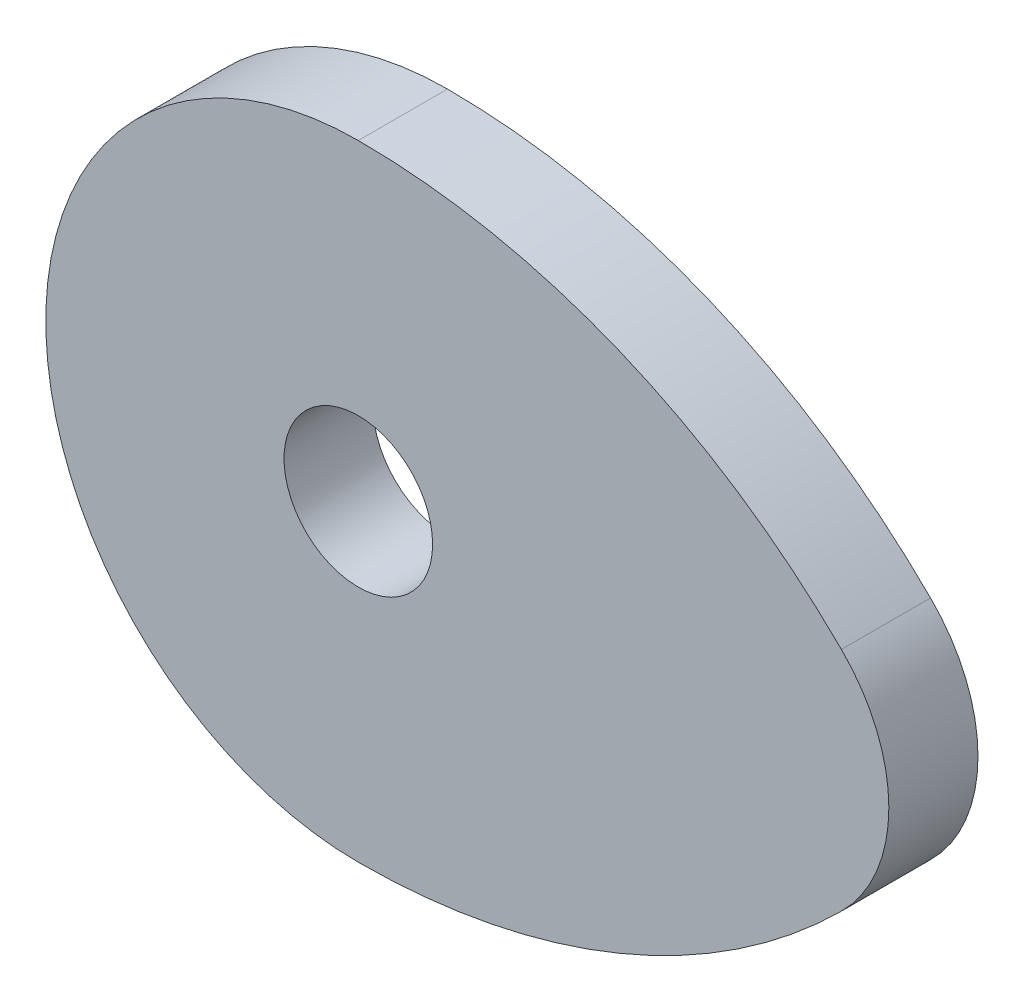
ISO-10303-21;
HEADER;
FILE_DESCRIPTION(('STEP AP214'),'2;1');
FILE_NAME('part.step','',(''),(''),'','','');
FILE_SCHEMA(('AUTOMOTIVE_DESIGN { 1 0 10303 214 1 1 1 1 }'));
ENDSEC;
DATA;
#1=APPLICATION_CONTEXT('core data for automotive mechanical design processes');
#2=APPLICATION_PROTOCOL_DEFINITION('international standard','automotive_design',2000,#1);
#3=PRODUCT_CONTEXT('',#1,'mechanical');
#4=PRODUCT('Part','Part','',(#3));
#5=PRODUCT_RELATED_PRODUCT_CATEGORY('part','',(#4));
#6=PRODUCT_DEFINITION_FORMATION('','',#4);
#7=PRODUCT_DEFINITION_CONTEXT('part definition',#1,'design');
#8=PRODUCT_DEFINITION('design','',#6,#7);
#9=PRODUCT_DEFINITION_SHAPE('','',#8);
#10=(LENGTH_UNIT() NAMED_UNIT(*) SI_UNIT(.MILLI.,.METRE.));
#11=(NAMED_UNIT(*) PLANE_ANGLE_UNIT() SI_UNIT($,.RADIAN.));
#12=(NAMED_UNIT(*) SI_UNIT($,.STERADIAN.) SOLID_ANGLE_UNIT());
#13=UNCERTAINTY_MEASURE_WITH_UNIT(LENGTH_MEASURE(1.E-05),#10,'distance_accuracy_value','');
#14=(GEOMETRIC_REPRESENTATION_CONTEXT(3) GLOBAL_UNCERTAINTY_ASSIGNED_CONTEXT((#13)) GLOBAL_UNIT_ASSIGNED_CONTEXT((#10,
#11,#12)) REPRESENTATION_CONTEXT('',''));
#15=CARTESIAN_POINT('',(0.,0.,0.));
#16=DIRECTION('',(0.,0.,1.));
#17=DIRECTION('',(1.,0.,0.));
#18=AXIS2_PLACEMENT_3D('',#15,#16,#17);
#19=CARTESIAN_POINT('',(12.5,-12.5467980655753,6.));
#20=DIRECTION('',(0.,0.,-1.));
#21=DIRECTION('',(-1.,0.,0.));
#22=AXIS2_PLACEMENT_3D('',#19,#20,#21);
#23=PLANE('',#22);
#24=CARTESIAN_POINT('',(0.,-25.0935961311506,6.));
#25=DIRECTION('',(0.,0.,-1.));
#26=DIRECTION('',(-1.,0.,0.));
#27=AXIS2_PLACEMENT_3D('',#24,#25,#26);
#28=CIRCLE('',#27,46.1281776350312);
#29=CARTESIAN_POINT('',(0.,21.0345815038806,6.));
#30=VERTEX_POINT('',#29);
#31=CARTESIAN_POINT('',(32.5134520010286,7.62771513392252,6.));
#32=VERTEX_POINT('',#31);
#33=EDGE_CURVE('E112',#30,#32,#28,.T.);
#34=ORIENTED_EDGE('',*,*,#33,.F.);
#35=CARTESIAN_POINT('',(0.,0.,6.));
#36=DIRECTION('',(0.,0.,1.));
#37=DIRECTION('',(1.,0.,0.));
#38=AXIS2_PLACEMENT_3D('',#35,#36,#37);
#39=CIRCLE('',#38,21.0345815038806);
#40=CARTESIAN_POINT('',(0.,-21.0345815038806,6.));
#41=VERTEX_POINT('',#40);
#42=EDGE_CURVE('E100',#30,#41,#39,.T.);
#43=ORIENTED_EDGE('',*,*,#42,.T.);
#44=CARTESIAN_POINT('',(0.,25.0935961311506,6.));
#45=DIRECTION('',(0.,0.,1.));
#46=DIRECTION('',(1.,0.,0.));
#47=AXIS2_PLACEMENT_3D('',#44,#45,#46);
#48=CIRCLE('',#47,46.1281776350312);
#49=CARTESIAN_POINT('',(32.5134520010286,-7.62771513392253,6.));
#50=VERTEX_POINT('',#49);
#51=EDGE_CURVE('E97',#41,#50,#48,.T.);
#52=ORIENTED_EDGE('',*,*,#51,.T.);
#53=CARTESIAN_POINT('',(25.,0.,6.));
#54=DIRECTION('',(0.,0.,1.));
#55=DIRECTION('',(1.,0.,0.));
#56=AXIS2_PLACEMENT_3D('',#53,#54,#55);
#57=CIRCLE('',#56,10.706726817101);
#58=EDGE_CURVE('E94',#50,#32,#57,.T.);
#59=ORIENTED_EDGE('',*,*,#58,.T.);
#60=EDGE_LOOP('',(#34,#43,#52,#59));
#61=FACE_BOUND('',#60,.T.);
#62=CARTESIAN_POINT('',(0.,0.,6.));
#63=DIRECTION('',(0.,0.,1.));
#64=DIRECTION('',(1.,0.,0.));
#65=AXIS2_PLACEMENT_3D('',#62,#63,#64);
#66=CIRCLE('',#65,5.);
#67=CARTESIAN_POINT('',(5.,0.,6.));
#68=VERTEX_POINT('',#67);
#69=EDGE_CURVE('E122',#68,#68,#66,.T.);
#70=ORIENTED_EDGE('',*,*,#69,.F.);
#71=EDGE_LOOP('',(#70));
#72=FACE_BOUND('',#71,.T.);
#73=ADVANCED_FACE('F51',(#61,#72),#23,.F.);
#74=CARTESIAN_POINT('',(12.5,-12.5467980655753,0.));
#75=DIRECTION('',(0.,0.,-1.));
#76=DIRECTION('',(-1.,0.,0.));
#77=AXIS2_PLACEMENT_3D('',#74,#75,#76);
#78=PLANE('',#77);
#79=CARTESIAN_POINT('',(0.,-25.0935961311506,0.));
#80=DIRECTION('',(0.,0.,-1.));
#81=DIRECTION('',(-1.,0.,0.));
#82=AXIS2_PLACEMENT_3D('',#79,#80,#81);
#83=CIRCLE('',#82,46.1281776350312);
#84=CARTESIAN_POINT('',(0.,21.0345815038806,0.));
#85=VERTEX_POINT('',#84);
#86=CARTESIAN_POINT('',(32.5134520010286,7.62771513392252,0.));
#87=VERTEX_POINT('',#86);
#88=EDGE_CURVE('E118',#85,#87,#83,.T.);
#89=ORIENTED_EDGE('',*,*,#88,.T.);
#90=CARTESIAN_POINT('',(25.,0.,0.));
#91=DIRECTION('',(0.,0.,1.));
#92=DIRECTION('',(1.,0.,0.));
#93=AXIS2_PLACEMENT_3D('',#90,#91,#92);
#94=CIRCLE('',#93,10.706726817101);
#95=CARTESIAN_POINT('',(32.5134520010286,-7.62771513392253,0.));
#96=VERTEX_POINT('',#95);
#97=EDGE_CURVE('E121',#96,#87,#94,.T.);
#98=ORIENTED_EDGE('',*,*,#97,.F.);
#99=CARTESIAN_POINT('',(0.,25.0935961311506,0.));
#100=DIRECTION('',(0.,0.,1.));
#101=DIRECTION('',(1.,0.,0.));
#102=AXIS2_PLACEMENT_3D('',#99,#100,#101);
#103=CIRCLE('',#102,46.1281776350312);
#104=CARTESIAN_POINT('',(0.,-21.0345815038806,0.));
#105=VERTEX_POINT('',#104);
#106=EDGE_CURVE('E107',#105,#96,#103,.T.);
#107=ORIENTED_EDGE('',*,*,#106,.F.);
#108=CARTESIAN_POINT('',(0.,0.,0.));
#109=DIRECTION('',(0.,0.,1.));
#110=DIRECTION('',(1.,0.,0.));
#111=AXIS2_PLACEMENT_3D('',#108,#109,#110);
#112=CIRCLE('',#111,21.0345815038806);
#113=EDGE_CURVE('E85',#85,#105,#112,.T.);
#114=ORIENTED_EDGE('',*,*,#113,.F.);
#115=EDGE_LOOP('',(#89,#98,#107,#114));
#116=FACE_BOUND('',#115,.T.);
#117=CARTESIAN_POINT('',(0.,0.,0.));
#118=DIRECTION('',(0.,0.,1.));
#119=DIRECTION('',(1.,0.,0.));
#120=AXIS2_PLACEMENT_3D('',#117,#118,#119);
#121=CIRCLE('',#120,5.);
#122=CARTESIAN_POINT('',(5.,0.,0.));
#123=VERTEX_POINT('',#122);
#124=EDGE_CURVE('E157',#123,#123,#121,.T.);
#125=ORIENTED_EDGE('',*,*,#124,.T.);
#126=EDGE_LOOP('',(#125));
#127=FACE_BOUND('',#126,.T.);
#128=ADVANCED_FACE('F127',(#116,#127),#78,.T.);
#129=CARTESIAN_POINT('',(0.,-25.0935961311506,6.));
#130=DIRECTION('',(0.,0.,-1.));
#131=DIRECTION('',(-1.,0.,0.));
#132=AXIS2_PLACEMENT_3D('',#129,#130,#131);
#133=CYLINDRICAL_SURFACE('',#132,46.1281776350312);
#134=ORIENTED_EDGE('',*,*,#88,.F.);
#135=DIRECTION('',(0.,0.,-1.));
#136=VECTOR('',#135,1.);
#137=CARTESIAN_POINT('',(0.,21.0345815038806,6.));
#138=LINE('',#137,#136);
#139=EDGE_CURVE('E12',#30,#85,#138,.T.);
#140=ORIENTED_EDGE('',*,*,#139,.F.);
#141=ORIENTED_EDGE('',*,*,#33,.T.);
#142=DIRECTION('',(0.,0.,-1.));
#143=VECTOR('',#142,1.);
#144=CARTESIAN_POINT('',(32.5134520010286,7.62771513392252,6.));
#145=LINE('',#144,#143);
#146=EDGE_CURVE('E55',#32,#87,#145,.T.);
#147=ORIENTED_EDGE('',*,*,#146,.T.);
#148=EDGE_LOOP('',(#134,#140,#141,#147));
#149=FACE_BOUND('',#148,.T.);
#150=ADVANCED_FACE('F53',(#149),#133,.T.);
#151=CARTESIAN_POINT('',(0.,0.,6.));
#152=DIRECTION('',(0.,0.,-1.));
#153=DIRECTION('',(-1.,0.,0.));
#154=AXIS2_PLACEMENT_3D('',#151,#152,#153);
#155=CYLINDRICAL_SURFACE('',#154,21.0345815038806);
#156=ORIENTED_EDGE('',*,*,#113,.T.);
#157=DIRECTION('',(0.,0.,-1.));
#158=VECTOR('',#157,1.);
#159=CARTESIAN_POINT('',(0.,-21.0345815038806,6.));
#160=LINE('',#159,#158);
#161=EDGE_CURVE('E61',#41,#105,#160,.T.);
#162=ORIENTED_EDGE('',*,*,#161,.F.);
#163=ORIENTED_EDGE('',*,*,#42,.F.);
#164=ORIENTED_EDGE('',*,*,#139,.T.);
#165=EDGE_LOOP('',(#156,#162,#163,#164));
#166=FACE_BOUND('',#165,.T.);
#167=ADVANCED_FACE('F130',(#166),#155,.T.);
#168=CARTESIAN_POINT('',(0.,25.0935961311506,6.));
#169=DIRECTION('',(0.,0.,-1.));
#170=DIRECTION('',(-1.,0.,0.));
#171=AXIS2_PLACEMENT_3D('',#168,#169,#170);
#172=CYLINDRICAL_SURFACE('',#171,46.1281776350312);
#173=ORIENTED_EDGE('',*,*,#106,.T.);
#174=DIRECTION('',(0.,0.,-1.));
#175=VECTOR('',#174,1.);
#176=CARTESIAN_POINT('',(32.5134520010286,-7.62771513392253,6.));
#177=LINE('',#176,#175);
#178=EDGE_CURVE('E104',#50,#96,#177,.T.);
#179=ORIENTED_EDGE('',*,*,#178,.F.);
#180=ORIENTED_EDGE('',*,*,#51,.F.);
#181=ORIENTED_EDGE('',*,*,#161,.T.);
#182=EDGE_LOOP('',(#173,#179,#180,#181));
#183=FACE_BOUND('',#182,.T.);
#184=ADVANCED_FACE('F105',(#183),#172,.T.);
#185=CARTESIAN_POINT('',(25.,0.,6.));
#186=DIRECTION('',(0.,0.,-1.));
#187=DIRECTION('',(-1.,0.,0.));
#188=AXIS2_PLACEMENT_3D('',#185,#186,#187);
#189=CYLINDRICAL_SURFACE('',#188,10.706726817101);
#190=ORIENTED_EDGE('',*,*,#97,.T.);
#191=ORIENTED_EDGE('',*,*,#146,.F.);
#192=ORIENTED_EDGE('',*,*,#58,.F.);
#193=ORIENTED_EDGE('',*,*,#178,.T.);
#194=EDGE_LOOP('',(#190,#191,#192,#193));
#195=FACE_BOUND('',#194,.T.);
#196=ADVANCED_FACE('F111',(#195),#189,.T.);
#197=CARTESIAN_POINT('',(0.,0.,6.));
#198=DIRECTION('',(0.,0.,-1.));
#199=DIRECTION('',(-1.,0.,0.));
#200=AXIS2_PLACEMENT_3D('',#197,#198,#199);
#201=CYLINDRICAL_SURFACE('',#200,5.);
#202=ORIENTED_EDGE('',*,*,#69,.T.);
#203=EDGE_LOOP('',(#202));
#204=FACE_BOUND('',#203,.T.);
#205=ORIENTED_EDGE('',*,*,#124,.F.);
#206=EDGE_LOOP('',(#205));
#207=FACE_BOUND('',#206,.T.);
#208=ADVANCED_FACE('F142',(#204,#207),#201,.F.);
#209=CLOSED_SHELL('',(#73,#128,#150,#167,#184,#196,#208));
#210=MANIFOLD_SOLID_BREP('B2',#209);
#211=ADVANCED_BREP_SHAPE_REPRESENTATION('',(#18,#210),#14);
#212=SHAPE_DEFINITION_REPRESENTATION(#9,#211);
ENDSEC;
END-ISO-10303-21;
